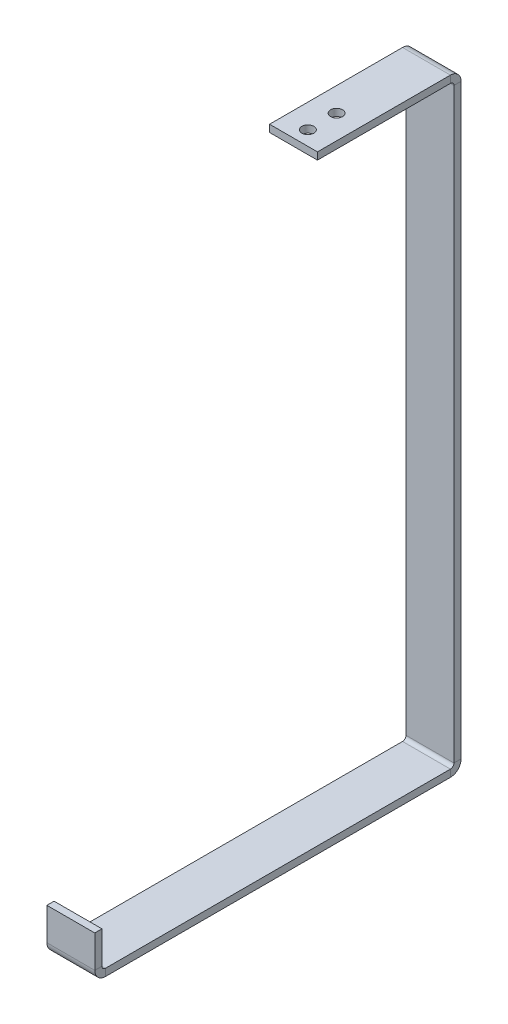
ISO-10303-21;
HEADER;
FILE_DESCRIPTION(('STEP AP214'),'2;1');
FILE_NAME('part.step','',(''),(''),'','','');
FILE_SCHEMA(('AUTOMOTIVE_DESIGN { 1 0 10303 214 1 1 1 1 }'));
ENDSEC;
DATA;
#1=APPLICATION_CONTEXT('core data for automotive mechanical design processes');
#2=APPLICATION_PROTOCOL_DEFINITION('international standard','automotive_design',2000,#1);
#3=PRODUCT_CONTEXT('',#1,'mechanical');
#4=PRODUCT('Part','Part','',(#3));
#5=PRODUCT_RELATED_PRODUCT_CATEGORY('part','',(#4));
#6=PRODUCT_DEFINITION_FORMATION('','',#4);
#7=PRODUCT_DEFINITION_CONTEXT('part definition',#1,'design');
#8=PRODUCT_DEFINITION('design','',#6,#7);
#9=PRODUCT_DEFINITION_SHAPE('','',#8);
#10=(LENGTH_UNIT() NAMED_UNIT(*) SI_UNIT(.MILLI.,.METRE.));
#11=(NAMED_UNIT(*) PLANE_ANGLE_UNIT() SI_UNIT($,.RADIAN.));
#12=(NAMED_UNIT(*) SI_UNIT($,.STERADIAN.) SOLID_ANGLE_UNIT());
#13=UNCERTAINTY_MEASURE_WITH_UNIT(LENGTH_MEASURE(1.E-05),#10,'distance_accuracy_value','');
#14=(GEOMETRIC_REPRESENTATION_CONTEXT(3) GLOBAL_UNCERTAINTY_ASSIGNED_CONTEXT((#13)) GLOBAL_UNIT_ASSIGNED_CONTEXT((#10,
#11,#12)) REPRESENTATION_CONTEXT('',''));
#15=CARTESIAN_POINT('',(0.,0.,0.));
#16=DIRECTION('',(0.,0.,1.));
#17=DIRECTION('',(1.,0.,0.));
#18=AXIS2_PLACEMENT_3D('',#15,#16,#17);
#19=CARTESIAN_POINT('',(-71.0000000000002,-75.0000000000001,-75.0000000000009));
#20=DIRECTION('',(1.,0.,0.));
#21=DIRECTION('',(0.,0.,-1.));
#22=AXIS2_PLACEMENT_3D('',#19,#20,#21);
#23=PLANE('',#22);
#24=DIRECTION('',(0.,0.,-1.));
#25=VECTOR('',#24,1.);
#26=CARTESIAN_POINT('',(-71.0000000000002,-75.7366000000001,-73.5000000000009));
#27=LINE('',#26,#25);
#28=CARTESIAN_POINT('',(-71.0000000000002,-75.7366000000001,-73.5000000000009));
#29=VERTEX_POINT('',#28);
#30=CARTESIAN_POINT('',(-71.0000000000002,-75.7366000000001,-75.0000000000009));
#31=VERTEX_POINT('',#30);
#32=EDGE_CURVE('E220',#29,#31,#27,.T.);
#33=ORIENTED_EDGE('',*,*,#32,.T.);
#34=DIRECTION('',(0.,1.,0.));
#35=VECTOR('',#34,1.);
#36=CARTESIAN_POINT('',(-71.0000000000002,-75.0000000000001,-75.0000000000009));
#37=LINE('',#36,#35);
#38=CARTESIAN_POINT('',(-71.0000000000002,-198.2634,-75.));
#39=VERTEX_POINT('',#38);
#40=EDGE_CURVE('E243',#39,#31,#37,.T.);
#41=ORIENTED_EDGE('',*,*,#40,.F.);
#42=DIRECTION('',(0.,0.,-1.));
#43=VECTOR('',#42,1.);
#44=CARTESIAN_POINT('',(-71.0000000000002,-198.2634,-73.5));
#45=LINE('',#44,#43);
#46=CARTESIAN_POINT('',(-71.0000000000002,-198.2634,-73.5));
#47=VERTEX_POINT('',#46);
#48=EDGE_CURVE('E234',#47,#39,#45,.T.);
#49=ORIENTED_EDGE('',*,*,#48,.F.);
#50=DIRECTION('',(0.,1.,0.));
#51=VECTOR('',#50,1.);
#52=CARTESIAN_POINT('',(-71.0000000000002,-75.0000000000001,-73.5000000000009));
#53=LINE('',#52,#51);
#54=EDGE_CURVE('E242',#47,#29,#53,.T.);
#55=ORIENTED_EDGE('',*,*,#54,.T.);
#56=EDGE_LOOP('',(#33,#41,#49,#55));
#57=FACE_BOUND('',#56,.T.);
#58=ADVANCED_FACE('F49',(#57),#23,.F.);
#59=CARTESIAN_POINT('',(-61.0000000000002,-199.,-75.));
#60=DIRECTION('',(-1.,0.,0.));
#61=DIRECTION('',(0.,0.,1.));
#62=AXIS2_PLACEMENT_3D('',#59,#60,#61);
#63=PLANE('',#62);
#64=DIRECTION('',(0.,0.,-1.));
#65=VECTOR('',#64,1.);
#66=CARTESIAN_POINT('',(-61.0000000000001,-75.7366000000001,-73.5000000000009));
#67=LINE('',#66,#65);
#68=CARTESIAN_POINT('',(-61.0000000000001,-75.7366000000001,-73.5000000000009));
#69=VERTEX_POINT('',#68);
#70=CARTESIAN_POINT('',(-61.0000000000001,-75.7366000000001,-75.0000000000009));
#71=VERTEX_POINT('',#70);
#72=EDGE_CURVE('E226',#69,#71,#67,.T.);
#73=ORIENTED_EDGE('',*,*,#72,.F.);
#74=DIRECTION('',(0.,-1.,0.));
#75=VECTOR('',#74,1.);
#76=CARTESIAN_POINT('',(-61.0000000000002,-199.,-73.5));
#77=LINE('',#76,#75);
#78=CARTESIAN_POINT('',(-61.0000000000001,-198.2634,-73.5));
#79=VERTEX_POINT('',#78);
#80=EDGE_CURVE('E246',#69,#79,#77,.T.);
#81=ORIENTED_EDGE('',*,*,#80,.T.);
#82=DIRECTION('',(0.,0.,-1.));
#83=VECTOR('',#82,1.);
#84=CARTESIAN_POINT('',(-61.0000000000002,-198.2634,-73.5));
#85=LINE('',#84,#83);
#86=CARTESIAN_POINT('',(-61.0000000000001,-198.2634,-75.));
#87=VERTEX_POINT('',#86);
#88=EDGE_CURVE('E229',#79,#87,#85,.T.);
#89=ORIENTED_EDGE('',*,*,#88,.T.);
#90=DIRECTION('',(0.,-1.,0.));
#91=VECTOR('',#90,1.);
#92=CARTESIAN_POINT('',(-61.0000000000002,-199.,-75.));
#93=LINE('',#92,#91);
#94=EDGE_CURVE('E245',#71,#87,#93,.T.);
#95=ORIENTED_EDGE('',*,*,#94,.F.);
#96=EDGE_LOOP('',(#73,#81,#89,#95));
#97=FACE_BOUND('',#96,.T.);
#98=ADVANCED_FACE('F363',(#97),#63,.F.);
#99=CARTESIAN_POINT('',(0.,-5.20343886813633E-13,-75.0000000000014));
#100=DIRECTION('',(0.,0.,1.));
#101=DIRECTION('',(0.,-1.,0.));
#102=AXIS2_PLACEMENT_3D('',#99,#100,#101);
#103=PLANE('',#102);
#104=DIRECTION('',(-1.,0.,0.));
#105=VECTOR('',#104,1.);
#106=CARTESIAN_POINT('',(-71.0000000000002,-75.7366000000001,-75.0000000000009));
#107=LINE('',#106,#105);
#108=EDGE_CURVE('E173',#31,#71,#107,.F.);
#109=ORIENTED_EDGE('',*,*,#108,.T.);
#110=ORIENTED_EDGE('',*,*,#94,.T.);
#111=DIRECTION('',(1.,0.,0.));
#112=VECTOR('',#111,1.);
#113=CARTESIAN_POINT('',(0.,-198.2634,-75.));
#114=LINE('',#113,#112);
#115=EDGE_CURVE('E237',#39,#87,#114,.T.);
#116=ORIENTED_EDGE('',*,*,#115,.F.);
#117=ORIENTED_EDGE('',*,*,#40,.T.);
#118=EDGE_LOOP('',(#109,#110,#116,#117));
#119=FACE_BOUND('',#118,.T.);
#120=ADVANCED_FACE('F421',(#119),#103,.F.);
#121=CARTESIAN_POINT('',(0.,-5.10008701937191E-13,-73.5000000000014));
#122=DIRECTION('',(0.,0.,1.));
#123=DIRECTION('',(0.,-1.,0.));
#124=AXIS2_PLACEMENT_3D('',#121,#122,#123);
#125=PLANE('',#124);
#126=ORIENTED_EDGE('',*,*,#80,.F.);
#127=DIRECTION('',(-1.,0.,0.));
#128=VECTOR('',#127,1.);
#129=CARTESIAN_POINT('',(-71.0000000000002,-75.7366000000001,-73.5000000000009));
#130=LINE('',#129,#128);
#131=EDGE_CURVE('E64',#29,#69,#130,.F.);
#132=ORIENTED_EDGE('',*,*,#131,.F.);
#133=ORIENTED_EDGE('',*,*,#54,.F.);
#134=DIRECTION('',(-1.,0.,0.));
#135=VECTOR('',#134,1.);
#136=CARTESIAN_POINT('',(-61.0000000000002,-198.2634,-73.5));
#137=LINE('',#136,#135);
#138=EDGE_CURVE('E232',#79,#47,#137,.T.);
#139=ORIENTED_EDGE('',*,*,#138,.F.);
#140=EDGE_LOOP('',(#126,#132,#133,#139));
#141=FACE_BOUND('',#140,.T.);
#142=ADVANCED_FACE('F364',(#141),#125,.T.);
#143=CARTESIAN_POINT('',(-71.0000000000002,-200.5,-73.5));
#144=DIRECTION('',(1.,0.,0.));
#145=DIRECTION('',(0.,0.,-1.));
#146=AXIS2_PLACEMENT_3D('',#143,#144,#145);
#147=PLANE('',#146);
#148=DIRECTION('',(0.,-1.,0.));
#149=VECTOR('',#148,1.);
#150=CARTESIAN_POINT('',(-71.0000000000002,-199.,-72.7634));
#151=LINE('',#150,#149);
#152=CARTESIAN_POINT('',(-71.0000000000002,-199.,-72.7634));
#153=VERTEX_POINT('',#152);
#154=CARTESIAN_POINT('',(-71.0000000000002,-200.5,-72.7634));
#155=VERTEX_POINT('',#154);
#156=EDGE_CURVE('E257',#153,#155,#151,.T.);
#157=ORIENTED_EDGE('',*,*,#156,.T.);
#158=DIRECTION('',(0.,0.,-1.));
#159=VECTOR('',#158,1.);
#160=CARTESIAN_POINT('',(-71.0000000000002,-200.5,-73.5));
#161=LINE('',#160,#159);
#162=CARTESIAN_POINT('',(-71.0000000000002,-200.5,-0.7366));
#163=VERTEX_POINT('',#162);
#164=EDGE_CURVE('E283',#163,#155,#161,.T.);
#165=ORIENTED_EDGE('',*,*,#164,.F.);
#166=DIRECTION('',(0.,-1.,0.));
#167=VECTOR('',#166,1.);
#168=CARTESIAN_POINT('',(-71.0000000000002,-199.,-0.736600000000004));
#169=LINE('',#168,#167);
#170=CARTESIAN_POINT('',(-71.0000000000002,-199.,-0.736600000000004));
#171=VERTEX_POINT('',#170);
#172=EDGE_CURVE('E274',#171,#163,#169,.T.);
#173=ORIENTED_EDGE('',*,*,#172,.F.);
#174=DIRECTION('',(0.,0.,-1.));
#175=VECTOR('',#174,1.);
#176=CARTESIAN_POINT('',(-71.0000000000002,-199.,-73.5));
#177=LINE('',#176,#175);
#178=EDGE_CURVE('E282',#171,#153,#177,.T.);
#179=ORIENTED_EDGE('',*,*,#178,.T.);
#180=EDGE_LOOP('',(#157,#165,#173,#179));
#181=FACE_BOUND('',#180,.T.);
#182=ADVANCED_FACE('F445',(#181),#147,.F.);
#183=CARTESIAN_POINT('',(-61.0000000000002,-200.5,0.));
#184=DIRECTION('',(-1.,0.,0.));
#185=DIRECTION('',(0.,0.,1.));
#186=AXIS2_PLACEMENT_3D('',#183,#184,#185);
#187=PLANE('',#186);
#188=DIRECTION('',(0.,-1.,0.));
#189=VECTOR('',#188,1.);
#190=CARTESIAN_POINT('',(-61.0000000000001,-199.,-72.7634));
#191=LINE('',#190,#189);
#192=CARTESIAN_POINT('',(-61.0000000000001,-199.,-72.7634));
#193=VERTEX_POINT('',#192);
#194=CARTESIAN_POINT('',(-61.0000000000001,-200.5,-72.7634));
#195=VERTEX_POINT('',#194);
#196=EDGE_CURVE('E266',#193,#195,#191,.T.);
#197=ORIENTED_EDGE('',*,*,#196,.F.);
#198=DIRECTION('',(0.,0.,1.));
#199=VECTOR('',#198,1.);
#200=CARTESIAN_POINT('',(-61.0000000000002,-199.,0.));
#201=LINE('',#200,#199);
#202=CARTESIAN_POINT('',(-61.0000000000001,-199.,-0.736600000000004));
#203=VERTEX_POINT('',#202);
#204=EDGE_CURVE('E286',#193,#203,#201,.T.);
#205=ORIENTED_EDGE('',*,*,#204,.T.);
#206=DIRECTION('',(0.,-1.,0.));
#207=VECTOR('',#206,1.);
#208=CARTESIAN_POINT('',(-61.0000000000002,-199.,-0.736600000000004));
#209=LINE('',#208,#207);
#210=CARTESIAN_POINT('',(-61.0000000000001,-200.5,-0.7366));
#211=VERTEX_POINT('',#210);
#212=EDGE_CURVE('E269',#203,#211,#209,.T.);
#213=ORIENTED_EDGE('',*,*,#212,.T.);
#214=DIRECTION('',(0.,0.,1.));
#215=VECTOR('',#214,1.);
#216=CARTESIAN_POINT('',(-61.0000000000002,-200.5,0.));
#217=LINE('',#216,#215);
#218=EDGE_CURVE('E285',#195,#211,#217,.T.);
#219=ORIENTED_EDGE('',*,*,#218,.F.);
#220=EDGE_LOOP('',(#197,#205,#213,#219));
#221=FACE_BOUND('',#220,.T.);
#222=ADVANCED_FACE('F350',(#221),#187,.F.);
#223=CARTESIAN_POINT('',(0.,-200.5,6.80011602582908E-13));
#224=DIRECTION('',(0.,1.,0.));
#225=DIRECTION('',(0.,0.,1.));
#226=AXIS2_PLACEMENT_3D('',#223,#224,#225);
#227=PLANE('',#226);
#228=DIRECTION('',(-1.,0.,0.));
#229=VECTOR('',#228,1.);
#230=CARTESIAN_POINT('',(-71.0000000000002,-200.5,-72.7634));
#231=LINE('',#230,#229);
#232=EDGE_CURVE('E251',#155,#195,#231,.F.);
#233=ORIENTED_EDGE('',*,*,#232,.T.);
#234=ORIENTED_EDGE('',*,*,#218,.T.);
#235=DIRECTION('',(1.,0.,0.));
#236=VECTOR('',#235,1.);
#237=CARTESIAN_POINT('',(0.,-200.5,-0.7366));
#238=LINE('',#237,#236);
#239=EDGE_CURVE('E277',#163,#211,#238,.T.);
#240=ORIENTED_EDGE('',*,*,#239,.F.);
#241=ORIENTED_EDGE('',*,*,#164,.T.);
#242=EDGE_LOOP('',(#233,#234,#240,#241));
#243=FACE_BOUND('',#242,.T.);
#244=ADVANCED_FACE('F437',(#243),#227,.F.);
#245=CARTESIAN_POINT('',(0.,-199.,6.76542155630955E-13));
#246=DIRECTION('',(0.,1.,0.));
#247=DIRECTION('',(0.,0.,1.));
#248=AXIS2_PLACEMENT_3D('',#245,#246,#247);
#249=PLANE('',#248);
#250=ORIENTED_EDGE('',*,*,#204,.F.);
#251=DIRECTION('',(-1.,0.,0.));
#252=VECTOR('',#251,1.);
#253=CARTESIAN_POINT('',(-71.0000000000002,-199.,-72.7634));
#254=LINE('',#253,#252);
#255=EDGE_CURVE('E72',#153,#193,#254,.F.);
#256=ORIENTED_EDGE('',*,*,#255,.F.);
#257=ORIENTED_EDGE('',*,*,#178,.F.);
#258=DIRECTION('',(-1.,0.,0.));
#259=VECTOR('',#258,1.);
#260=CARTESIAN_POINT('',(-61.0000000000002,-199.,-0.736600000000004));
#261=LINE('',#260,#259);
#262=EDGE_CURVE('E272',#203,#171,#261,.T.);
#263=ORIENTED_EDGE('',*,*,#262,.F.);
#264=EDGE_LOOP('',(#250,#256,#257,#263));
#265=FACE_BOUND('',#264,.T.);
#266=ADVANCED_FACE('F351',(#265),#249,.T.);
#267=CARTESIAN_POINT('',(-61.0000000000002,-199.,1.5));
#268=DIRECTION('',(-1.,0.,0.));
#269=DIRECTION('',(0.,0.,1.));
#270=AXIS2_PLACEMENT_3D('',#267,#268,#269);
#271=PLANE('',#270);
#272=DIRECTION('',(0.,0.,1.));
#273=VECTOR('',#272,1.);
#274=CARTESIAN_POINT('',(-61.0000000000001,-198.2634,0.));
#275=LINE('',#274,#273);
#276=CARTESIAN_POINT('',(-61.0000000000001,-198.2634,0.));
#277=VERTEX_POINT('',#276);
#278=CARTESIAN_POINT('',(-61.0000000000002,-198.2634,1.5));
#279=VERTEX_POINT('',#278);
#280=EDGE_CURVE('E308',#277,#279,#275,.T.);
#281=ORIENTED_EDGE('',*,*,#280,.F.);
#282=DIRECTION('',(0.,1.,0.));
#283=VECTOR('',#282,1.);
#284=CARTESIAN_POINT('',(-61.0000000000002,-199.,0.));
#285=LINE('',#284,#283);
#286=CARTESIAN_POINT('',(-61.0000000000002,-191.499960444039,0.));
#287=VERTEX_POINT('',#286);
#288=EDGE_CURVE('E311',#277,#287,#285,.T.);
#289=ORIENTED_EDGE('',*,*,#288,.T.);
#290=DIRECTION('',(0.,0.,-1.));
#291=VECTOR('',#290,1.);
#292=CARTESIAN_POINT('',(-61.0000000000002,-191.499960444039,1.5));
#293=LINE('',#292,#291);
#294=CARTESIAN_POINT('',(-61.0000000000002,-191.499960444039,1.5));
#295=VERTEX_POINT('',#294);
#296=EDGE_CURVE('E13',#295,#287,#293,.T.);
#297=ORIENTED_EDGE('',*,*,#296,.F.);
#298=DIRECTION('',(0.,1.,0.));
#299=VECTOR('',#298,1.);
#300=CARTESIAN_POINT('',(-61.0000000000002,-199.,1.5));
#301=LINE('',#300,#299);
#302=EDGE_CURVE('E314',#279,#295,#301,.T.);
#303=ORIENTED_EDGE('',*,*,#302,.F.);
#304=EDGE_LOOP('',(#281,#289,#297,#303));
#305=FACE_BOUND('',#304,.T.);
#306=ADVANCED_FACE('F51',(#305),#271,.F.);
#307=CARTESIAN_POINT('',(-71.0000000000002,-199.,1.5));
#308=DIRECTION('',(1.,0.,0.));
#309=DIRECTION('',(0.,0.,-1.));
#310=AXIS2_PLACEMENT_3D('',#307,#308,#309);
#311=PLANE('',#310);
#312=DIRECTION('',(0.,0.,1.));
#313=VECTOR('',#312,1.);
#314=CARTESIAN_POINT('',(-71.0000000000002,-198.2634,0.));
#315=LINE('',#314,#313);
#316=CARTESIAN_POINT('',(-71.0000000000002,-198.2634,0.));
#317=VERTEX_POINT('',#316);
#318=CARTESIAN_POINT('',(-71.0000000000002,-198.2634,1.5));
#319=VERTEX_POINT('',#318);
#320=EDGE_CURVE('E298',#317,#319,#315,.T.);
#321=ORIENTED_EDGE('',*,*,#320,.T.);
#322=DIRECTION('',(0.,-1.,0.));
#323=VECTOR('',#322,1.);
#324=CARTESIAN_POINT('',(-71.0000000000002,-199.,1.5));
#325=LINE('',#324,#323);
#326=CARTESIAN_POINT('',(-71.0000000000002,-191.499960444039,1.5));
#327=VERTEX_POINT('',#326);
#328=EDGE_CURVE('E319',#327,#319,#325,.T.);
#329=ORIENTED_EDGE('',*,*,#328,.F.);
#330=DIRECTION('',(0.,0.,-1.));
#331=VECTOR('',#330,1.);
#332=CARTESIAN_POINT('',(-71.0000000000002,-191.499960444039,1.5));
#333=LINE('',#332,#331);
#334=CARTESIAN_POINT('',(-71.0000000000002,-191.499960444039,0.));
#335=VERTEX_POINT('',#334);
#336=EDGE_CURVE('E57',#327,#335,#333,.T.);
#337=ORIENTED_EDGE('',*,*,#336,.T.);
#338=DIRECTION('',(0.,-1.,0.));
#339=VECTOR('',#338,1.);
#340=CARTESIAN_POINT('',(-71.0000000000002,-199.,0.));
#341=LINE('',#340,#339);
#342=EDGE_CURVE('E317',#335,#317,#341,.T.);
#343=ORIENTED_EDGE('',*,*,#342,.T.);
#344=EDGE_LOOP('',(#321,#329,#337,#343));
#345=FACE_BOUND('',#344,.T.);
#346=ADVANCED_FACE('F331',(#345),#311,.F.);
#347=CARTESIAN_POINT('',(0.,0.,1.5));
#348=DIRECTION('',(0.,0.,1.));
#349=DIRECTION('',(1.,0.,0.));
#350=AXIS2_PLACEMENT_3D('',#347,#348,#349);
#351=PLANE('',#350);
#352=ORIENTED_EDGE('',*,*,#328,.T.);
#353=DIRECTION('',(-1.,0.,0.));
#354=VECTOR('',#353,1.);
#355=CARTESIAN_POINT('',(-71.0000000000002,-198.2634,1.5));
#356=LINE('',#355,#354);
#357=EDGE_CURVE('E291',#319,#279,#356,.F.);
#358=ORIENTED_EDGE('',*,*,#357,.T.);
#359=ORIENTED_EDGE('',*,*,#302,.T.);
#360=DIRECTION('',(-1.,0.,0.));
#361=VECTOR('',#360,1.);
#362=CARTESIAN_POINT('',(-71.0000000000002,-191.499960444039,1.5));
#363=LINE('',#362,#361);
#364=EDGE_CURVE('E316',#295,#327,#363,.T.);
#365=ORIENTED_EDGE('',*,*,#364,.T.);
#366=EDGE_LOOP('',(#352,#358,#359,#365));
#367=FACE_BOUND('',#366,.T.);
#368=ADVANCED_FACE('F462',(#367),#351,.T.);
#369=CARTESIAN_POINT('',(0.,0.,0.));
#370=DIRECTION('',(0.,0.,1.));
#371=DIRECTION('',(1.,0.,0.));
#372=AXIS2_PLACEMENT_3D('',#369,#370,#371);
#373=PLANE('',#372);
#374=DIRECTION('',(-1.,0.,0.));
#375=VECTOR('',#374,1.);
#376=CARTESIAN_POINT('',(-71.0000000000002,-198.2634,0.));
#377=LINE('',#376,#375);
#378=EDGE_CURVE('E304',#317,#277,#377,.F.);
#379=ORIENTED_EDGE('',*,*,#378,.F.);
#380=ORIENTED_EDGE('',*,*,#342,.F.);
#381=DIRECTION('',(-1.,0.,0.));
#382=VECTOR('',#381,1.);
#383=CARTESIAN_POINT('',(-71.0000000000002,-191.499960444039,0.));
#384=LINE('',#383,#382);
#385=EDGE_CURVE('E323',#287,#335,#384,.T.);
#386=ORIENTED_EDGE('',*,*,#385,.F.);
#387=ORIENTED_EDGE('',*,*,#288,.F.);
#388=EDGE_LOOP('',(#379,#380,#386,#387));
#389=FACE_BOUND('',#388,.T.);
#390=ADVANCED_FACE('F337',(#389),#373,.F.);
#391=CARTESIAN_POINT('',(-71.0000000000002,-191.499960444039,1.5));
#392=DIRECTION('',(0.,-1.,0.));
#393=DIRECTION('',(0.,0.,-1.));
#394=AXIS2_PLACEMENT_3D('',#391,#392,#393);
#395=PLANE('',#394);
#396=ORIENTED_EDGE('',*,*,#385,.T.);
#397=ORIENTED_EDGE('',*,*,#336,.F.);
#398=ORIENTED_EDGE('',*,*,#364,.F.);
#399=ORIENTED_EDGE('',*,*,#296,.T.);
#400=EDGE_LOOP('',(#396,#397,#398,#399));
#401=FACE_BOUND('',#400,.T.);
#402=ADVANCED_FACE('F458',(#401),#395,.F.);
#403=CARTESIAN_POINT('',(-61.0000000000001,-198.2634,-0.736600000000007));
#404=DIRECTION('',(1.,0.,0.));
#405=DIRECTION('',(0.,0.,-1.));
#406=AXIS2_PLACEMENT_3D('',#403,#404,#405);
#407=PLANE('',#406);
#408=ORIENTED_EDGE('',*,*,#212,.F.);
#409=CARTESIAN_POINT('',(-61.0000000000001,-198.2634,-0.736600000000007));
#410=DIRECTION('',(-1.,0.,0.));
#411=DIRECTION('',(0.,0.,1.));
#412=AXIS2_PLACEMENT_3D('',#409,#410,#411);
#413=CIRCLE('',#412,0.736600000000004);
#414=EDGE_CURVE('E301',#277,#203,#413,.F.);
#415=ORIENTED_EDGE('',*,*,#414,.F.);
#416=ORIENTED_EDGE('',*,*,#280,.T.);
#417=CARTESIAN_POINT('',(-61.0000000000001,-198.2634,-0.736600000000007));
#418=DIRECTION('',(-1.,0.,0.));
#419=DIRECTION('',(0.,0.,1.));
#420=AXIS2_PLACEMENT_3D('',#417,#418,#419);
#421=CIRCLE('',#420,2.2366);
#422=EDGE_CURVE('E294',#279,#211,#421,.F.);
#423=ORIENTED_EDGE('',*,*,#422,.T.);
#424=EDGE_LOOP('',(#408,#415,#416,#423));
#425=FACE_BOUND('',#424,.T.);
#426=ADVANCED_FACE('F347',(#425),#407,.T.);
#427=CARTESIAN_POINT('',(-71.0000000000002,-198.2634,-0.736600000000007));
#428=DIRECTION('',(1.,0.,0.));
#429=DIRECTION('',(0.,0.,-1.));
#430=AXIS2_PLACEMENT_3D('',#427,#428,#429);
#431=PLANE('',#430);
#432=CARTESIAN_POINT('',(-71.0000000000002,-198.2634,-0.736600000000007));
#433=DIRECTION('',(-1.,0.,0.));
#434=DIRECTION('',(0.,0.,1.));
#435=AXIS2_PLACEMENT_3D('',#432,#433,#434);
#436=CIRCLE('',#435,0.736600000000004);
#437=EDGE_CURVE('E288',#171,#317,#436,.T.);
#438=ORIENTED_EDGE('',*,*,#437,.F.);
#439=ORIENTED_EDGE('',*,*,#172,.T.);
#440=CARTESIAN_POINT('',(-71.0000000000002,-198.2634,-0.736600000000007));
#441=DIRECTION('',(-1.,0.,0.));
#442=DIRECTION('',(0.,0.,1.));
#443=AXIS2_PLACEMENT_3D('',#440,#441,#442);
#444=CIRCLE('',#443,2.2366);
#445=EDGE_CURVE('E295',#163,#319,#444,.T.);
#446=ORIENTED_EDGE('',*,*,#445,.T.);
#447=ORIENTED_EDGE('',*,*,#320,.F.);
#448=EDGE_LOOP('',(#438,#439,#446,#447));
#449=FACE_BOUND('',#448,.T.);
#450=ADVANCED_FACE('F452',(#449),#431,.F.);
#451=CARTESIAN_POINT('',(-71.0000000000002,-198.2634,-0.736600000000007));
#452=DIRECTION('',(-1.,0.,0.));
#453=DIRECTION('',(0.,-1.,0.));
#454=AXIS2_PLACEMENT_3D('',#451,#452,#453);
#455=CYLINDRICAL_SURFACE('',#454,2.2366);
#456=ORIENTED_EDGE('',*,*,#357,.F.);
#457=ORIENTED_EDGE('',*,*,#445,.F.);
#458=ORIENTED_EDGE('',*,*,#239,.T.);
#459=ORIENTED_EDGE('',*,*,#422,.F.);
#460=EDGE_LOOP('',(#456,#457,#458,#459));
#461=FACE_BOUND('',#460,.T.);
#462=ADVANCED_FACE('F449',(#461),#455,.T.);
#463=CARTESIAN_POINT('',(-71.0000000000002,-198.2634,-0.736600000000007));
#464=DIRECTION('',(-1.,0.,0.));
#465=DIRECTION('',(0.,-1.,0.));
#466=AXIS2_PLACEMENT_3D('',#463,#464,#465);
#467=CYLINDRICAL_SURFACE('',#466,0.736600000000004);
#468=ORIENTED_EDGE('',*,*,#378,.T.);
#469=ORIENTED_EDGE('',*,*,#414,.T.);
#470=ORIENTED_EDGE('',*,*,#262,.T.);
#471=ORIENTED_EDGE('',*,*,#437,.T.);
#472=EDGE_LOOP('',(#468,#469,#470,#471));
#473=FACE_BOUND('',#472,.T.);
#474=ADVANCED_FACE('F342',(#473),#467,.F.);
#475=CARTESIAN_POINT('',(-61.0000000000001,-198.2634,-72.7634));
#476=DIRECTION('',(1.,0.,0.));
#477=DIRECTION('',(0.,0.,-1.));
#478=AXIS2_PLACEMENT_3D('',#475,#476,#477);
#479=PLANE('',#478);
#480=ORIENTED_EDGE('',*,*,#88,.F.);
#481=CARTESIAN_POINT('',(-61.0000000000001,-198.2634,-72.7634));
#482=DIRECTION('',(-1.,0.,0.));
#483=DIRECTION('',(0.,0.,1.));
#484=AXIS2_PLACEMENT_3D('',#481,#482,#483);
#485=CIRCLE('',#484,0.73659999999999);
#486=EDGE_CURVE('E260',#193,#79,#485,.F.);
#487=ORIENTED_EDGE('',*,*,#486,.F.);
#488=ORIENTED_EDGE('',*,*,#196,.T.);
#489=CARTESIAN_POINT('',(-61.0000000000001,-198.2634,-72.7634));
#490=DIRECTION('',(-1.,0.,0.));
#491=DIRECTION('',(0.,0.,1.));
#492=AXIS2_PLACEMENT_3D('',#489,#490,#491);
#493=CIRCLE('',#492,2.23659999999999);
#494=EDGE_CURVE('E253',#195,#87,#493,.F.);
#495=ORIENTED_EDGE('',*,*,#494,.T.);
#496=EDGE_LOOP('',(#480,#487,#488,#495));
#497=FACE_BOUND('',#496,.T.);
#498=ADVANCED_FACE('F359',(#497),#479,.T.);
#499=CARTESIAN_POINT('',(-71.0000000000002,-198.2634,-72.7634));
#500=DIRECTION('',(1.,0.,0.));
#501=DIRECTION('',(0.,0.,-1.));
#502=AXIS2_PLACEMENT_3D('',#499,#500,#501);
#503=PLANE('',#502);
#504=CARTESIAN_POINT('',(-71.0000000000002,-198.2634,-72.7634));
#505=DIRECTION('',(-1.,0.,0.));
#506=DIRECTION('',(0.,0.,1.));
#507=AXIS2_PLACEMENT_3D('',#504,#505,#506);
#508=CIRCLE('',#507,0.73659999999999);
#509=EDGE_CURVE('E248',#47,#153,#508,.T.);
#510=ORIENTED_EDGE('',*,*,#509,.F.);
#511=ORIENTED_EDGE('',*,*,#48,.T.);
#512=CARTESIAN_POINT('',(-71.0000000000002,-198.2634,-72.7634));
#513=DIRECTION('',(-1.,0.,0.));
#514=DIRECTION('',(0.,0.,1.));
#515=AXIS2_PLACEMENT_3D('',#512,#513,#514);
#516=CIRCLE('',#515,2.23659999999999);
#517=EDGE_CURVE('E254',#39,#155,#516,.T.);
#518=ORIENTED_EDGE('',*,*,#517,.T.);
#519=ORIENTED_EDGE('',*,*,#156,.F.);
#520=EDGE_LOOP('',(#510,#511,#518,#519));
#521=FACE_BOUND('',#520,.T.);
#522=ADVANCED_FACE('F428',(#521),#503,.F.);
#523=CARTESIAN_POINT('',(-71.0000000000002,-198.2634,-72.7634));
#524=DIRECTION('',(-1.,0.,0.));
#525=DIRECTION('',(0.,0.,-1.));
#526=AXIS2_PLACEMENT_3D('',#523,#524,#525);
#527=CYLINDRICAL_SURFACE('',#526,2.23659999999999);
#528=ORIENTED_EDGE('',*,*,#232,.F.);
#529=ORIENTED_EDGE('',*,*,#517,.F.);
#530=ORIENTED_EDGE('',*,*,#115,.T.);
#531=ORIENTED_EDGE('',*,*,#494,.F.);
#532=EDGE_LOOP('',(#528,#529,#530,#531));
#533=FACE_BOUND('',#532,.T.);
#534=ADVANCED_FACE('F425',(#533),#527,.T.);
#535=CARTESIAN_POINT('',(-71.0000000000002,-198.2634,-72.7634));
#536=DIRECTION('',(-1.,0.,0.));
#537=DIRECTION('',(0.,0.,-1.));
#538=AXIS2_PLACEMENT_3D('',#535,#536,#537);
#539=CYLINDRICAL_SURFACE('',#538,0.73659999999999);
#540=ORIENTED_EDGE('',*,*,#255,.T.);
#541=ORIENTED_EDGE('',*,*,#486,.T.);
#542=ORIENTED_EDGE('',*,*,#138,.T.);
#543=ORIENTED_EDGE('',*,*,#509,.T.);
#544=EDGE_LOOP('',(#540,#541,#542,#543));
#545=FACE_BOUND('',#544,.T.);
#546=ADVANCED_FACE('F354',(#545),#539,.F.);
#547=CARTESIAN_POINT('',(-61.0000000000001,-75.7366000000001,-72.7634000000009));
#548=DIRECTION('',(1.,0.,0.));
#549=DIRECTION('',(0.,0.,-1.));
#550=AXIS2_PLACEMENT_3D('',#547,#548,#549);
#551=PLANE('',#550);
#552=DIRECTION('',(0.,1.,0.));
#553=VECTOR('',#552,1.);
#554=CARTESIAN_POINT('',(-61.0000000000002,-75.0000000000001,-72.7634000000009));
#555=LINE('',#554,#553);
#556=CARTESIAN_POINT('',(-61.0000000000001,-75.0000000000001,-72.7634000000009));
#557=VERTEX_POINT('',#556);
#558=CARTESIAN_POINT('',(-61.0000000000001,-73.5000000000001,-72.7634000000009));
#559=VERTEX_POINT('',#558);
#560=EDGE_CURVE('E372',#557,#559,#555,.T.);
#561=ORIENTED_EDGE('',*,*,#560,.F.);
#562=CARTESIAN_POINT('',(-61.0000000000001,-75.7366000000001,-72.7634000000009));
#563=DIRECTION('',(-1.,0.,0.));
#564=DIRECTION('',(0.,0.,1.));
#565=AXIS2_PLACEMENT_3D('',#562,#563,#564);
#566=CIRCLE('',#565,0.736600000000018);
#567=EDGE_CURVE('E176',#69,#557,#566,.F.);
#568=ORIENTED_EDGE('',*,*,#567,.F.);
#569=ORIENTED_EDGE('',*,*,#72,.T.);
#570=CARTESIAN_POINT('',(-61.0000000000001,-75.7366000000001,-72.7634000000009));
#571=DIRECTION('',(-1.,0.,0.));
#572=DIRECTION('',(0.,0.,1.));
#573=AXIS2_PLACEMENT_3D('',#570,#571,#572);
#574=CIRCLE('',#573,2.23660000000002);
#575=EDGE_CURVE('E219',#71,#559,#574,.F.);
#576=ORIENTED_EDGE('',*,*,#575,.T.);
#577=EDGE_LOOP('',(#561,#568,#569,#576));
#578=FACE_BOUND('',#577,.T.);
#579=ADVANCED_FACE('F370',(#578),#551,.T.);
#580=CARTESIAN_POINT('',(-71.0000000000002,-75.7366000000001,-72.7634000000009));
#581=DIRECTION('',(1.,0.,0.));
#582=DIRECTION('',(0.,0.,-1.));
#583=AXIS2_PLACEMENT_3D('',#580,#581,#582);
#584=PLANE('',#583);
#585=CARTESIAN_POINT('',(-71.0000000000002,-75.7366000000001,-72.7634000000009));
#586=DIRECTION('',(-1.,0.,0.));
#587=DIRECTION('',(0.,0.,1.));
#588=AXIS2_PLACEMENT_3D('',#585,#586,#587);
#589=CIRCLE('',#588,0.736600000000018);
#590=CARTESIAN_POINT('',(-71.0000000000002,-75.0000000000001,-72.7634000000009));
#591=VERTEX_POINT('',#590);
#592=EDGE_CURVE('E183',#591,#29,#589,.T.);
#593=ORIENTED_EDGE('',*,*,#592,.F.);
#594=DIRECTION('',(0.,1.,0.));
#595=VECTOR('',#594,1.);
#596=CARTESIAN_POINT('',(-71.0000000000002,-75.0000000000001,-72.7634000000009));
#597=LINE('',#596,#595);
#598=CARTESIAN_POINT('',(-71.0000000000002,-73.5000000000001,-72.7634000000009));
#599=VERTEX_POINT('',#598);
#600=EDGE_CURVE('E180',#591,#599,#597,.T.);
#601=ORIENTED_EDGE('',*,*,#600,.T.);
#602=CARTESIAN_POINT('',(-71.0000000000002,-75.7366000000001,-72.7634000000009));
#603=DIRECTION('',(-1.,0.,0.));
#604=DIRECTION('',(0.,0.,1.));
#605=AXIS2_PLACEMENT_3D('',#602,#603,#604);
#606=CIRCLE('',#605,2.23660000000002);
#607=EDGE_CURVE('E166',#599,#31,#606,.T.);
#608=ORIENTED_EDGE('',*,*,#607,.T.);
#609=ORIENTED_EDGE('',*,*,#32,.F.);
#610=EDGE_LOOP('',(#593,#601,#608,#609));
#611=FACE_BOUND('',#610,.T.);
#612=ADVANCED_FACE('F181',(#611),#584,.F.);
#613=CARTESIAN_POINT('',(-71.0000000000002,-75.7366000000001,-72.7634000000009));
#614=DIRECTION('',(-1.,0.,0.));
#615=DIRECTION('',(0.,1.,0.));
#616=AXIS2_PLACEMENT_3D('',#613,#614,#615);
#617=CYLINDRICAL_SURFACE('',#616,2.23660000000002);
#618=ORIENTED_EDGE('',*,*,#108,.F.);
#619=ORIENTED_EDGE('',*,*,#607,.F.);
#620=DIRECTION('',(1.,0.,0.));
#621=VECTOR('',#620,1.);
#622=CARTESIAN_POINT('',(0.,-73.5000000000001,-72.7634000000009));
#623=LINE('',#622,#621);
#624=EDGE_CURVE('E171',#599,#559,#623,.T.);
#625=ORIENTED_EDGE('',*,*,#624,.T.);
#626=ORIENTED_EDGE('',*,*,#575,.F.);
#627=EDGE_LOOP('',(#618,#619,#625,#626));
#628=FACE_BOUND('',#627,.T.);
#629=ADVANCED_FACE('F168',(#628),#617,.T.);
#630=CARTESIAN_POINT('',(-71.0000000000002,-75.7366000000001,-72.7634000000009));
#631=DIRECTION('',(-1.,0.,0.));
#632=DIRECTION('',(0.,1.,0.));
#633=AXIS2_PLACEMENT_3D('',#630,#631,#632);
#634=CYLINDRICAL_SURFACE('',#633,0.736600000000018);
#635=ORIENTED_EDGE('',*,*,#131,.T.);
#636=ORIENTED_EDGE('',*,*,#567,.T.);
#637=DIRECTION('',(-1.,0.,0.));
#638=VECTOR('',#637,1.);
#639=CARTESIAN_POINT('',(-61.0000000000002,-75.0000000000001,-72.7634000000009));
#640=LINE('',#639,#638);
#641=EDGE_CURVE('E187',#557,#591,#640,.T.);
#642=ORIENTED_EDGE('',*,*,#641,.T.);
#643=ORIENTED_EDGE('',*,*,#592,.T.);
#644=EDGE_LOOP('',(#635,#636,#642,#643));
#645=FACE_BOUND('',#644,.T.);
#646=ADVANCED_FACE('F367',(#645),#634,.F.);
#647=CARTESIAN_POINT('',(-71.0000000000002,-73.4999999999998,-45.0000000000009));
#648=DIRECTION('',(1.,0.,0.));
#649=DIRECTION('',(0.,0.,-1.));
#650=AXIS2_PLACEMENT_3D('',#647,#648,#649);
#651=PLANE('',#650);
#652=ORIENTED_EDGE('',*,*,#600,.F.);
#653=DIRECTION('',(0.,0.,1.));
#654=VECTOR('',#653,1.);
#655=CARTESIAN_POINT('',(-71.0000000000002,-74.9999999999998,-45.0000000000008));
#656=LINE('',#655,#654);
#657=CARTESIAN_POINT('',(-71.0000000000002,-74.9999999999998,-45.0000000000008));
#658=VERTEX_POINT('',#657);
#659=EDGE_CURVE('E196',#591,#658,#656,.T.);
#660=ORIENTED_EDGE('',*,*,#659,.T.);
#661=DIRECTION('',(0.,-1.,0.));
#662=VECTOR('',#661,1.);
#663=CARTESIAN_POINT('',(-71.0000000000002,-73.4999999999998,-45.0000000000009));
#664=LINE('',#663,#662);
#665=CARTESIAN_POINT('',(-71.0000000000002,-73.4999999999998,-45.0000000000009));
#666=VERTEX_POINT('',#665);
#667=EDGE_CURVE('E201',#666,#658,#664,.T.);
#668=ORIENTED_EDGE('',*,*,#667,.F.);
#669=DIRECTION('',(0.,0.,1.));
#670=VECTOR('',#669,1.);
#671=CARTESIAN_POINT('',(-71.0000000000002,-73.4999999999998,-45.0000000000009));
#672=LINE('',#671,#670);
#673=EDGE_CURVE('E192',#599,#666,#672,.T.);
#674=ORIENTED_EDGE('',*,*,#673,.F.);
#675=EDGE_LOOP('',(#652,#660,#668,#674));
#676=FACE_BOUND('',#675,.T.);
#677=ADVANCED_FACE('F199',(#676),#651,.F.);
#678=CARTESIAN_POINT('',(-61.0000000000002,-73.5000000000001,-73.5000000000009));
#679=DIRECTION('',(-1.,0.,0.));
#680=DIRECTION('',(0.,0.,1.));
#681=AXIS2_PLACEMENT_3D('',#678,#679,#680);
#682=PLANE('',#681);
#683=ORIENTED_EDGE('',*,*,#560,.T.);
#684=DIRECTION('',(0.,0.,-1.));
#685=VECTOR('',#684,1.);
#686=CARTESIAN_POINT('',(-61.0000000000002,-73.5000000000001,-73.5000000000009));
#687=LINE('',#686,#685);
#688=CARTESIAN_POINT('',(-61.0000000000002,-73.4999999999998,-45.0000000000009));
#689=VERTEX_POINT('',#688);
#690=EDGE_CURVE('E195',#689,#559,#687,.T.);
#691=ORIENTED_EDGE('',*,*,#690,.F.);
#692=DIRECTION('',(0.,-1.,0.));
#693=VECTOR('',#692,1.);
#694=CARTESIAN_POINT('',(-61.0000000000002,-73.4999999999998,-45.0000000000009));
#695=LINE('',#694,#693);
#696=CARTESIAN_POINT('',(-61.0000000000002,-74.9999999999998,-45.0000000000008));
#697=VERTEX_POINT('',#696);
#698=EDGE_CURVE('E212',#689,#697,#695,.T.);
#699=ORIENTED_EDGE('',*,*,#698,.T.);
#700=DIRECTION('',(0.,0.,-1.));
#701=VECTOR('',#700,1.);
#702=CARTESIAN_POINT('',(-61.0000000000002,-75.0000000000001,-73.5000000000009));
#703=LINE('',#702,#701);
#704=EDGE_CURVE('E203',#697,#557,#703,.T.);
#705=ORIENTED_EDGE('',*,*,#704,.T.);
#706=EDGE_LOOP('',(#683,#691,#699,#705));
#707=FACE_BOUND('',#706,.T.);
#708=ADVANCED_FACE('F401',(#707),#682,.F.);
#709=CARTESIAN_POINT('',(0.,-73.4999999999994,7.52869988573934E-13));
#710=DIRECTION('',(0.,-1.,0.));
#711=DIRECTION('',(0.,0.,-1.));
#712=AXIS2_PLACEMENT_3D('',#709,#710,#711);
#713=PLANE('',#712);
#714=CARTESIAN_POINT('',(-66.0000000000002,-73.4999999999999,-48.0000000000004));
#715=DIRECTION('',(0.,1.,0.));
#716=DIRECTION('',(0.,0.,1.));
#717=AXIS2_PLACEMENT_3D('',#714,#715,#716);
#718=CIRCLE('',#717,1.25);
#719=CARTESIAN_POINT('',(-66.0000000000002,-73.4999999999999,-46.7500000000004));
#720=VERTEX_POINT('',#719);
#721=EDGE_CURVE('E374',#720,#720,#718,.T.);
#722=ORIENTED_EDGE('',*,*,#721,.F.);
#723=EDGE_LOOP('',(#722));
#724=FACE_BOUND('',#723,.T.);
#725=CARTESIAN_POINT('',(-66.0000000000002,-73.4999999999999,-54.0000000000004));
#726=DIRECTION('',(0.,1.,0.));
#727=DIRECTION('',(0.,0.,1.));
#728=AXIS2_PLACEMENT_3D('',#725,#726,#727);
#729=CIRCLE('',#728,1.25);
#730=CARTESIAN_POINT('',(-66.0000000000002,-73.4999999999999,-52.7500000000004));
#731=VERTEX_POINT('',#730);
#732=EDGE_CURVE('E380',#731,#731,#729,.T.);
#733=ORIENTED_EDGE('',*,*,#732,.F.);
#734=EDGE_LOOP('',(#733));
#735=FACE_BOUND('',#734,.T.);
#736=ORIENTED_EDGE('',*,*,#624,.F.);
#737=ORIENTED_EDGE('',*,*,#673,.T.);
#738=DIRECTION('',(1.,0.,0.));
#739=VECTOR('',#738,1.);
#740=CARTESIAN_POINT('',(-61.0000000000002,-73.4999999999998,-45.0000000000009));
#741=LINE('',#740,#739);
#742=EDGE_CURVE('E202',#666,#689,#741,.T.);
#743=ORIENTED_EDGE('',*,*,#742,.T.);
#744=ORIENTED_EDGE('',*,*,#690,.T.);
#745=EDGE_LOOP('',(#736,#737,#743,#744));
#746=FACE_BOUND('',#745,.T.);
#747=ADVANCED_FACE('F191',(#724,#735,#746),#713,.F.);
#748=CARTESIAN_POINT('',(0.,-74.9999999999994,7.66747776381749E-13));
#749=DIRECTION('',(0.,-1.,0.));
#750=DIRECTION('',(0.,0.,-1.));
#751=AXIS2_PLACEMENT_3D('',#748,#749,#750);
#752=PLANE('',#751);
#753=CARTESIAN_POINT('',(-66.0000000000002,-74.9999999999999,-48.0000000000004));
#754=DIRECTION('',(0.,-1.,0.));
#755=DIRECTION('',(0.,0.,-1.));
#756=AXIS2_PLACEMENT_3D('',#753,#754,#755);
#757=CIRCLE('',#756,1.25);
#758=CARTESIAN_POINT('',(-66.0000000000002,-74.9999999999999,-49.2500000000004));
#759=VERTEX_POINT('',#758);
#760=EDGE_CURVE('E377',#759,#759,#757,.F.);
#761=ORIENTED_EDGE('',*,*,#760,.T.);
#762=EDGE_LOOP('',(#761));
#763=FACE_BOUND('',#762,.T.);
#764=CARTESIAN_POINT('',(-66.0000000000002,-74.9999999999999,-54.0000000000004));
#765=DIRECTION('',(0.,-1.,0.));
#766=DIRECTION('',(0.,0.,-1.));
#767=AXIS2_PLACEMENT_3D('',#764,#765,#766);
#768=CIRCLE('',#767,1.25);
#769=CARTESIAN_POINT('',(-66.0000000000002,-74.9999999999999,-55.2500000000004));
#770=VERTEX_POINT('',#769);
#771=EDGE_CURVE('E383',#770,#770,#768,.F.);
#772=ORIENTED_EDGE('',*,*,#771,.T.);
#773=EDGE_LOOP('',(#772));
#774=FACE_BOUND('',#773,.T.);
#775=ORIENTED_EDGE('',*,*,#659,.F.);
#776=ORIENTED_EDGE('',*,*,#641,.F.);
#777=ORIENTED_EDGE('',*,*,#704,.F.);
#778=DIRECTION('',(1.,0.,0.));
#779=VECTOR('',#778,1.);
#780=CARTESIAN_POINT('',(-61.0000000000002,-74.9999999999998,-45.0000000000008));
#781=LINE('',#780,#779);
#782=EDGE_CURVE('E207',#658,#697,#781,.T.);
#783=ORIENTED_EDGE('',*,*,#782,.F.);
#784=EDGE_LOOP('',(#775,#776,#777,#783));
#785=FACE_BOUND('',#784,.T.);
#786=ADVANCED_FACE('F389',(#763,#774,#785),#752,.T.);
#787=CARTESIAN_POINT('',(-61.0000000000002,-73.4999999999998,-45.0000000000009));
#788=DIRECTION('',(0.,0.,-1.));
#789=DIRECTION('',(0.,1.,0.));
#790=AXIS2_PLACEMENT_3D('',#787,#788,#789);
#791=PLANE('',#790);
#792=ORIENTED_EDGE('',*,*,#782,.T.);
#793=ORIENTED_EDGE('',*,*,#698,.F.);
#794=ORIENTED_EDGE('',*,*,#742,.F.);
#795=ORIENTED_EDGE('',*,*,#667,.T.);
#796=EDGE_LOOP('',(#792,#793,#794,#795));
#797=FACE_BOUND('',#796,.T.);
#798=ADVANCED_FACE('F406',(#797),#791,.F.);
#799=CARTESIAN_POINT('',(-66.0000000000002,-200.501000000001,-53.9999999999991));
#800=DIRECTION('',(0.,1.,0.));
#801=DIRECTION('',(0.,0.,1.));
#802=AXIS2_PLACEMENT_3D('',#799,#800,#801);
#803=CYLINDRICAL_SURFACE('',#802,1.25);
#804=ORIENTED_EDGE('',*,*,#771,.F.);
#805=EDGE_LOOP('',(#804));
#806=FACE_BOUND('',#805,.T.);
#807=ORIENTED_EDGE('',*,*,#732,.T.);
#808=EDGE_LOOP('',(#807));
#809=FACE_BOUND('',#808,.T.);
#810=ADVANCED_FACE('F395',(#806,#809),#803,.F.);
#811=CARTESIAN_POINT('',(-66.0000000000002,-200.501000000001,-47.9999999999991));
#812=DIRECTION('',(0.,1.,0.));
#813=DIRECTION('',(0.,0.,1.));
#814=AXIS2_PLACEMENT_3D('',#811,#812,#813);
#815=CYLINDRICAL_SURFACE('',#814,1.25);
#816=ORIENTED_EDGE('',*,*,#760,.F.);
#817=EDGE_LOOP('',(#816));
#818=FACE_BOUND('',#817,.T.);
#819=ORIENTED_EDGE('',*,*,#721,.T.);
#820=EDGE_LOOP('',(#819));
#821=FACE_BOUND('',#820,.T.);
#822=ADVANCED_FACE('F392',(#818,#821),#815,.F.);
#823=CLOSED_SHELL('',(#58,#98,#120,#142,#182,#222,#244,#266,#306,#346,#368,#390,#402,#426,#450,
#462,#474,#498,#522,#534,#546,#579,#612,#629,#646,#677,#708,#747,#786,#798,#810,#822));
#824=MANIFOLD_SOLID_BREP('B2',#823);
#825=ADVANCED_BREP_SHAPE_REPRESENTATION('',(#18,#824),#14);
#826=SHAPE_DEFINITION_REPRESENTATION(#9,#825);
ENDSEC;
END-ISO-10303-21;
